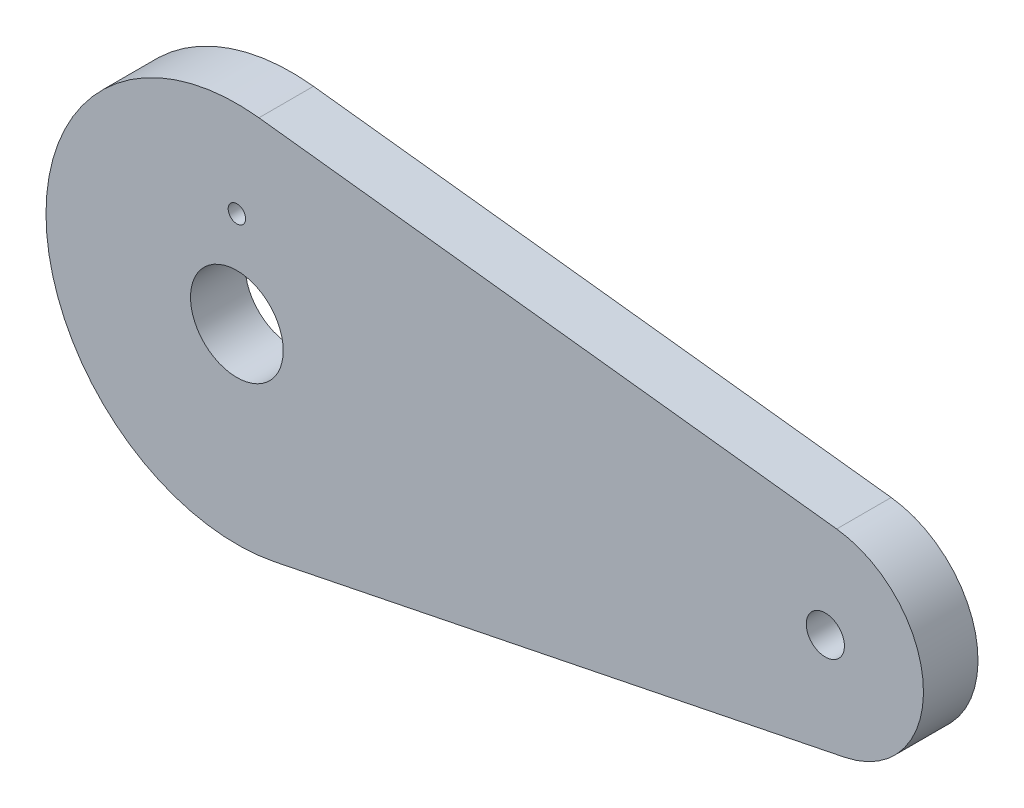
ISO-10303-21;
HEADER;
FILE_DESCRIPTION(('STEP AP214'),'2;1');
FILE_NAME('part.step','',(''),(''),'','','');
FILE_SCHEMA(('AUTOMOTIVE_DESIGN { 1 0 10303 214 1 1 1 1 }'));
ENDSEC;
DATA;
#1=APPLICATION_CONTEXT('core data for automotive mechanical design processes');
#2=APPLICATION_PROTOCOL_DEFINITION('international standard','automotive_design',2000,#1);
#3=PRODUCT_CONTEXT('',#1,'mechanical');
#4=PRODUCT('Part','Part','',(#3));
#5=PRODUCT_RELATED_PRODUCT_CATEGORY('part','',(#4));
#6=PRODUCT_DEFINITION_FORMATION('','',#4);
#7=PRODUCT_DEFINITION_CONTEXT('part definition',#1,'design');
#8=PRODUCT_DEFINITION('design','',#6,#7);
#9=PRODUCT_DEFINITION_SHAPE('','',#8);
#10=(LENGTH_UNIT() NAMED_UNIT(*) SI_UNIT(.MILLI.,.METRE.));
#11=(NAMED_UNIT(*) PLANE_ANGLE_UNIT() SI_UNIT($,.RADIAN.));
#12=(NAMED_UNIT(*) SI_UNIT($,.STERADIAN.) SOLID_ANGLE_UNIT());
#13=UNCERTAINTY_MEASURE_WITH_UNIT(LENGTH_MEASURE(1.E-05),#10,'distance_accuracy_value','');
#14=(GEOMETRIC_REPRESENTATION_CONTEXT(3) GLOBAL_UNCERTAINTY_ASSIGNED_CONTEXT((#13)) GLOBAL_UNIT_ASSIGNED_CONTEXT((#10,
#11,#12)) REPRESENTATION_CONTEXT('',''));
#15=CARTESIAN_POINT('',(0.,0.,0.));
#16=DIRECTION('',(0.,0.,1.));
#17=DIRECTION('',(1.,0.,0.));
#18=AXIS2_PLACEMENT_3D('',#15,#16,#17);
#19=CARTESIAN_POINT('',(-20.22,57.58,-5.));
#20=DIRECTION('',(0.,0.,1.));
#21=DIRECTION('',(1.,0.,0.));
#22=AXIS2_PLACEMENT_3D('',#19,#20,#21);
#23=CYLINDRICAL_SURFACE('',#22,17.5);
#24=CARTESIAN_POINT('',(-20.22,57.58,0.));
#25=DIRECTION('',(0.,0.,1.));
#26=DIRECTION('',(1.,0.,0.));
#27=AXIS2_PLACEMENT_3D('',#24,#25,#26);
#28=CIRCLE('',#27,17.5);
#29=CARTESIAN_POINT('',(-18.1975910319152,74.9627460996763,0.));
#30=VERTEX_POINT('',#29);
#31=CARTESIAN_POINT('',(-16.7380637792928,40.4298944564493,0.));
#32=VERTEX_POINT('',#31);
#33=EDGE_CURVE('E100',#30,#32,#28,.T.);
#34=ORIENTED_EDGE('',*,*,#33,.F.);
#35=DIRECTION('',(0.,0.,1.));
#36=VECTOR('',#35,1.);
#37=CARTESIAN_POINT('',(-18.1975910319152,74.9627460996763,-5.));
#38=LINE('',#37,#36);
#39=CARTESIAN_POINT('',(-18.1975910319152,74.9627460996763,-5.));
#40=VERTEX_POINT('',#39);
#41=EDGE_CURVE('E11',#40,#30,#38,.T.);
#42=ORIENTED_EDGE('',*,*,#41,.F.);
#43=CARTESIAN_POINT('',(-20.22,57.58,-5.));
#44=DIRECTION('',(0.,0.,1.));
#45=DIRECTION('',(1.,0.,0.));
#46=AXIS2_PLACEMENT_3D('',#43,#44,#45);
#47=CIRCLE('',#46,17.5);
#48=CARTESIAN_POINT('',(-16.7380637792928,40.4298944564493,-5.));
#49=VERTEX_POINT('',#48);
#50=EDGE_CURVE('E93',#40,#49,#47,.T.);
#51=ORIENTED_EDGE('',*,*,#50,.T.);
#52=DIRECTION('',(0.,0.,1.));
#53=VECTOR('',#52,1.);
#54=CARTESIAN_POINT('',(-16.7380637792928,40.4298944564493,-5.));
#55=LINE('',#54,#53);
#56=EDGE_CURVE('E38',#49,#32,#55,.T.);
#57=ORIENTED_EDGE('',*,*,#56,.T.);
#58=EDGE_LOOP('',(#34,#42,#51,#57));
#59=FACE_BOUND('',#58,.T.);
#60=ADVANCED_FACE('F35',(#59),#23,.T.);
#61=CARTESIAN_POINT('',(-18.1975910319152,74.9627460996763,-5.));
#62=DIRECTION('',(0.115566226747706,0.993299777124357,0.));
#63=DIRECTION('',(-0.993299777124357,0.115566226747706,0.));
#64=AXIS2_PLACEMENT_3D('',#61,#62,#63);
#65=PLANE('',#64);
#66=DIRECTION('',(-0.993299777124357,0.115566226747706,0.));
#67=VECTOR('',#66,1.);
#68=CARTESIAN_POINT('',(-18.1975910319152,74.9627460996763,0.));
#69=LINE('',#68,#67);
#70=CARTESIAN_POINT('',(34.7719298912099,68.7999664366815,0.));
#71=VERTEX_POINT('',#70);
#72=EDGE_CURVE('E95',#71,#30,#69,.T.);
#73=ORIENTED_EDGE('',*,*,#72,.F.);
#74=DIRECTION('',(0.,0.,1.));
#75=VECTOR('',#74,1.);
#76=CARTESIAN_POINT('',(34.7719298912099,68.7999664366815,-5.));
#77=LINE('',#76,#75);
#78=CARTESIAN_POINT('',(34.7719298912099,68.7999664366815,-5.));
#79=VERTEX_POINT('',#78);
#80=EDGE_CURVE('E44',#79,#71,#77,.T.);
#81=ORIENTED_EDGE('',*,*,#80,.F.);
#82=DIRECTION('',(-0.993299777124357,0.115566226747706,0.));
#83=VECTOR('',#82,1.);
#84=CARTESIAN_POINT('',(-18.1975910319152,74.9627460996763,-5.));
#85=LINE('',#84,#83);
#86=EDGE_CURVE('E90',#79,#40,#85,.T.);
#87=ORIENTED_EDGE('',*,*,#86,.T.);
#88=ORIENTED_EDGE('',*,*,#41,.T.);
#89=EDGE_LOOP('',(#73,#81,#87,#88));
#90=FACE_BOUND('',#89,.T.);
#91=ADVANCED_FACE('F111',(#90),#65,.T.);
#92=CARTESIAN_POINT('',(33.7318338504805,59.8602684425623,-5.));
#93=DIRECTION('',(0.,0.,1.));
#94=DIRECTION('',(1.,0.,0.));
#95=AXIS2_PLACEMENT_3D('',#92,#93,#94);
#96=CYLINDRICAL_SURFACE('',#95,9.00000000000001);
#97=CARTESIAN_POINT('',(33.7318338504805,59.8602684425623,0.));
#98=DIRECTION('',(0.,0.,1.));
#99=DIRECTION('',(-1.,0.,0.));
#100=AXIS2_PLACEMENT_3D('',#97,#98,#99);
#101=CIRCLE('',#100,9.00000000000001);
#102=CARTESIAN_POINT('',(35.5225439068442,51.0402141630219,0.));
#103=VERTEX_POINT('',#102);
#104=EDGE_CURVE('E85',#103,#71,#101,.T.);
#105=ORIENTED_EDGE('',*,*,#104,.F.);
#106=DIRECTION('',(0.,0.,1.));
#107=VECTOR('',#106,1.);
#108=CARTESIAN_POINT('',(35.5225439068442,51.0402141630219,-5.));
#109=LINE('',#108,#107);
#110=CARTESIAN_POINT('',(35.5225439068442,51.0402141630219,-5.));
#111=VERTEX_POINT('',#110);
#112=EDGE_CURVE('E80',#111,#103,#109,.T.);
#113=ORIENTED_EDGE('',*,*,#112,.F.);
#114=CARTESIAN_POINT('',(33.7318338504805,59.8602684425623,-5.));
#115=DIRECTION('',(0.,0.,1.));
#116=DIRECTION('',(-1.,0.,0.));
#117=AXIS2_PLACEMENT_3D('',#114,#115,#116);
#118=CIRCLE('',#117,9.00000000000001);
#119=EDGE_CURVE('E83',#111,#79,#118,.T.);
#120=ORIENTED_EDGE('',*,*,#119,.T.);
#121=ORIENTED_EDGE('',*,*,#80,.T.);
#122=EDGE_LOOP('',(#105,#113,#120,#121));
#123=FACE_BOUND('',#122,.T.);
#124=ADVANCED_FACE('F82',(#123),#96,.T.);
#125=CARTESIAN_POINT('',(-16.7380637792928,40.4298944564493,-5.));
#126=DIRECTION('',(0.198967784040418,-0.980006031060037,0.));
#127=DIRECTION('',(0.980006031060037,0.198967784040418,0.));
#128=AXIS2_PLACEMENT_3D('',#125,#126,#127);
#129=PLANE('',#128);
#130=DIRECTION('',(0.980006031060037,0.198967784040418,0.));
#131=VECTOR('',#130,1.);
#132=CARTESIAN_POINT('',(-16.7380637792928,40.4298944564493,0.));
#133=LINE('',#132,#131);
#134=EDGE_CURVE('E103',#32,#103,#133,.T.);
#135=ORIENTED_EDGE('',*,*,#134,.F.);
#136=ORIENTED_EDGE('',*,*,#56,.F.);
#137=DIRECTION('',(0.980006031060037,0.198967784040418,0.));
#138=VECTOR('',#137,1.);
#139=CARTESIAN_POINT('',(-16.7380637792928,40.4298944564493,-5.));
#140=LINE('',#139,#138);
#141=EDGE_CURVE('E89',#49,#111,#140,.T.);
#142=ORIENTED_EDGE('',*,*,#141,.T.);
#143=ORIENTED_EDGE('',*,*,#112,.T.);
#144=EDGE_LOOP('',(#135,#136,#142,#143));
#145=FACE_BOUND('',#144,.T.);
#146=ADVANCED_FACE('F92',(#145),#129,.T.);
#147=CARTESIAN_POINT('',(-20.22,57.58,-5.));
#148=DIRECTION('',(0.,0.,1.));
#149=DIRECTION('',(1.,0.,0.));
#150=AXIS2_PLACEMENT_3D('',#147,#148,#149);
#151=PLANE('',#150);
#152=CARTESIAN_POINT('',(-20.22,66.33,-5.));
#153=DIRECTION('',(0.,0.,1.));
#154=DIRECTION('',(1.,0.,0.));
#155=AXIS2_PLACEMENT_3D('',#152,#153,#154);
#156=CIRCLE('',#155,0.799999999999998);
#157=CARTESIAN_POINT('',(-19.42,66.33,-5.));
#158=VERTEX_POINT('',#157);
#159=EDGE_CURVE('E148',#158,#158,#156,.T.);
#160=ORIENTED_EDGE('',*,*,#159,.T.);
#161=EDGE_LOOP('',(#160));
#162=FACE_BOUND('',#161,.T.);
#163=CARTESIAN_POINT('',(33.7318338504805,59.8602684425623,-5.));
#164=DIRECTION('',(0.,0.,1.));
#165=DIRECTION('',(1.,0.,0.));
#166=AXIS2_PLACEMENT_3D('',#163,#164,#165);
#167=CIRCLE('',#166,1.75);
#168=CARTESIAN_POINT('',(35.4818338504805,59.8602684425623,-5.));
#169=VERTEX_POINT('',#168);
#170=EDGE_CURVE('E156',#169,#169,#167,.T.);
#171=ORIENTED_EDGE('',*,*,#170,.T.);
#172=EDGE_LOOP('',(#171));
#173=FACE_BOUND('',#172,.T.);
#174=CARTESIAN_POINT('',(-20.22,57.58,-5.));
#175=DIRECTION('',(0.,0.,1.));
#176=DIRECTION('',(1.,0.,0.));
#177=AXIS2_PLACEMENT_3D('',#174,#175,#176);
#178=CIRCLE('',#177,4.25);
#179=CARTESIAN_POINT('',(-15.97,57.58,-5.));
#180=VERTEX_POINT('',#179);
#181=EDGE_CURVE('E104',#180,#180,#178,.T.);
#182=ORIENTED_EDGE('',*,*,#181,.T.);
#183=EDGE_LOOP('',(#182));
#184=FACE_BOUND('',#183,.T.);
#185=ORIENTED_EDGE('',*,*,#50,.F.);
#186=ORIENTED_EDGE('',*,*,#86,.F.);
#187=ORIENTED_EDGE('',*,*,#119,.F.);
#188=ORIENTED_EDGE('',*,*,#141,.F.);
#189=EDGE_LOOP('',(#185,#186,#187,#188));
#190=FACE_BOUND('',#189,.T.);
#191=ADVANCED_FACE('F88',(#162,#173,#184,#190),#151,.F.);
#192=CARTESIAN_POINT('',(-20.22,57.58,0.));
#193=DIRECTION('',(0.,0.,1.));
#194=DIRECTION('',(1.,0.,0.));
#195=AXIS2_PLACEMENT_3D('',#192,#193,#194);
#196=PLANE('',#195);
#197=CARTESIAN_POINT('',(-20.22,66.33,0.));
#198=DIRECTION('',(0.,0.,1.));
#199=DIRECTION('',(1.,0.,0.));
#200=AXIS2_PLACEMENT_3D('',#197,#198,#199);
#201=CIRCLE('',#200,0.799999999999998);
#202=CARTESIAN_POINT('',(-19.42,66.33,0.));
#203=VERTEX_POINT('',#202);
#204=EDGE_CURVE('E151',#203,#203,#201,.T.);
#205=ORIENTED_EDGE('',*,*,#204,.F.);
#206=EDGE_LOOP('',(#205));
#207=FACE_BOUND('',#206,.T.);
#208=CARTESIAN_POINT('',(33.7318338504805,59.8602684425623,0.));
#209=DIRECTION('',(0.,0.,1.));
#210=DIRECTION('',(1.,0.,0.));
#211=AXIS2_PLACEMENT_3D('',#208,#209,#210);
#212=CIRCLE('',#211,1.75);
#213=CARTESIAN_POINT('',(35.4818338504805,59.8602684425623,0.));
#214=VERTEX_POINT('',#213);
#215=EDGE_CURVE('E153',#214,#214,#212,.T.);
#216=ORIENTED_EDGE('',*,*,#215,.F.);
#217=EDGE_LOOP('',(#216));
#218=FACE_BOUND('',#217,.T.);
#219=CARTESIAN_POINT('',(-20.22,57.58,0.));
#220=DIRECTION('',(0.,0.,1.));
#221=DIRECTION('',(1.,0.,0.));
#222=AXIS2_PLACEMENT_3D('',#219,#220,#221);
#223=CIRCLE('',#222,4.25);
#224=CARTESIAN_POINT('',(-15.97,57.58,0.));
#225=VERTEX_POINT('',#224);
#226=EDGE_CURVE('E159',#225,#225,#223,.T.);
#227=ORIENTED_EDGE('',*,*,#226,.F.);
#228=EDGE_LOOP('',(#227));
#229=FACE_BOUND('',#228,.T.);
#230=ORIENTED_EDGE('',*,*,#33,.T.);
#231=ORIENTED_EDGE('',*,*,#134,.T.);
#232=ORIENTED_EDGE('',*,*,#104,.T.);
#233=ORIENTED_EDGE('',*,*,#72,.T.);
#234=EDGE_LOOP('',(#230,#231,#232,#233));
#235=FACE_BOUND('',#234,.T.);
#236=ADVANCED_FACE('F110',(#207,#218,#229,#235),#196,.T.);
#237=CARTESIAN_POINT('',(-20.22,57.58,-5.));
#238=DIRECTION('',(0.,0.,1.));
#239=DIRECTION('',(1.,0.,0.));
#240=AXIS2_PLACEMENT_3D('',#237,#238,#239);
#241=CYLINDRICAL_SURFACE('',#240,4.25);
#242=ORIENTED_EDGE('',*,*,#181,.F.);
#243=EDGE_LOOP('',(#242));
#244=FACE_BOUND('',#243,.T.);
#245=ORIENTED_EDGE('',*,*,#226,.T.);
#246=EDGE_LOOP('',(#245));
#247=FACE_BOUND('',#246,.T.);
#248=ADVANCED_FACE('F129',(#244,#247),#241,.F.);
#249=CARTESIAN_POINT('',(33.7318338504805,59.8602684425623,-5.));
#250=DIRECTION('',(0.,0.,1.));
#251=DIRECTION('',(1.,0.,0.));
#252=AXIS2_PLACEMENT_3D('',#249,#250,#251);
#253=CYLINDRICAL_SURFACE('',#252,1.75);
#254=ORIENTED_EDGE('',*,*,#170,.F.);
#255=EDGE_LOOP('',(#254));
#256=FACE_BOUND('',#255,.T.);
#257=ORIENTED_EDGE('',*,*,#215,.T.);
#258=EDGE_LOOP('',(#257));
#259=FACE_BOUND('',#258,.T.);
#260=ADVANCED_FACE('F136',(#256,#259),#253,.F.);
#261=CARTESIAN_POINT('',(-20.22,66.33,-5.));
#262=DIRECTION('',(0.,0.,1.));
#263=DIRECTION('',(1.,0.,0.));
#264=AXIS2_PLACEMENT_3D('',#261,#262,#263);
#265=CYLINDRICAL_SURFACE('',#264,0.799999999999998);
#266=ORIENTED_EDGE('',*,*,#159,.F.);
#267=EDGE_LOOP('',(#266));
#268=FACE_BOUND('',#267,.T.);
#269=ORIENTED_EDGE('',*,*,#204,.T.);
#270=EDGE_LOOP('',(#269));
#271=FACE_BOUND('',#270,.T.);
#272=ADVANCED_FACE('F140',(#268,#271),#265,.F.);
#273=CLOSED_SHELL('',(#60,#91,#124,#146,#191,#236,#248,#260,#272));
#274=MANIFOLD_SOLID_BREP('B2',#273);
#275=ADVANCED_BREP_SHAPE_REPRESENTATION('',(#18,#274),#14);
#276=SHAPE_DEFINITION_REPRESENTATION(#9,#275);
ENDSEC;
END-ISO-10303-21;
